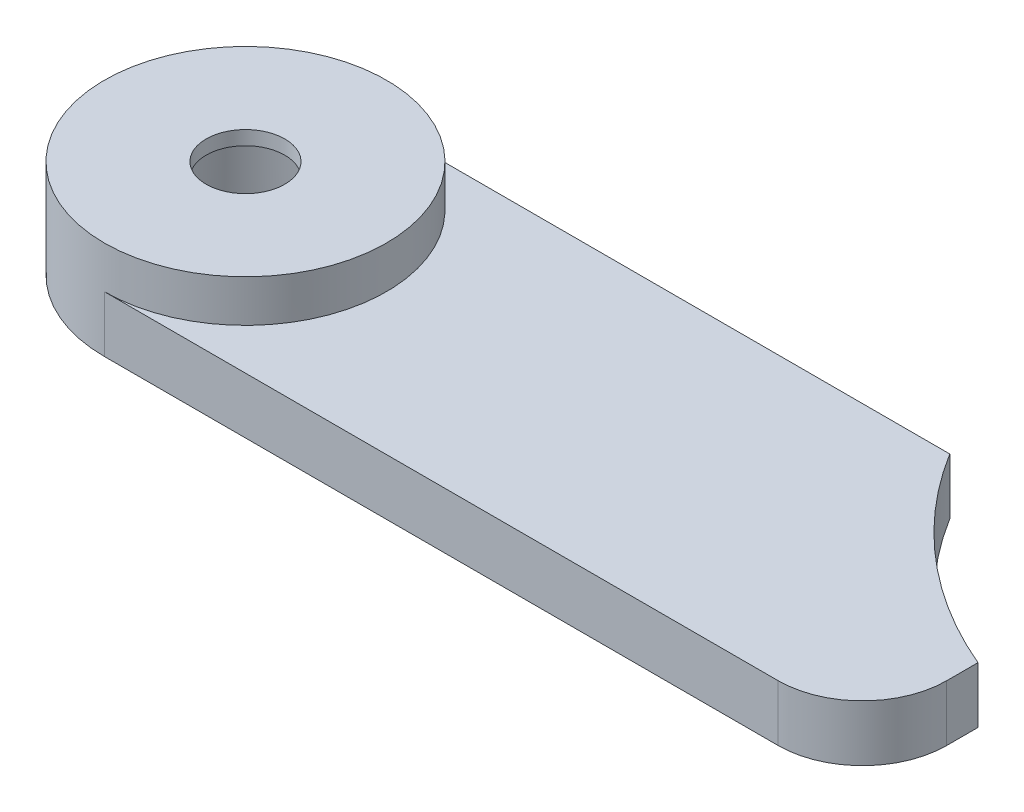
ISO-10303-21;
HEADER;
FILE_DESCRIPTION(('STEP AP214'),'2;1');
FILE_NAME('part.step','',(''),(''),'','','');
FILE_SCHEMA(('AUTOMOTIVE_DESIGN { 1 0 10303 214 1 1 1 1 }'));
ENDSEC;
DATA;
#1=APPLICATION_CONTEXT('core data for automotive mechanical design processes');
#2=APPLICATION_PROTOCOL_DEFINITION('international standard','automotive_design',2000,#1);
#3=PRODUCT_CONTEXT('',#1,'mechanical');
#4=PRODUCT('Part','Part','',(#3));
#5=PRODUCT_RELATED_PRODUCT_CATEGORY('part','',(#4));
#6=PRODUCT_DEFINITION_FORMATION('','',#4);
#7=PRODUCT_DEFINITION_CONTEXT('part definition',#1,'design');
#8=PRODUCT_DEFINITION('design','',#6,#7);
#9=PRODUCT_DEFINITION_SHAPE('','',#8);
#10=(LENGTH_UNIT() NAMED_UNIT(*) SI_UNIT(.MILLI.,.METRE.));
#11=(NAMED_UNIT(*) PLANE_ANGLE_UNIT() SI_UNIT($,.RADIAN.));
#12=(NAMED_UNIT(*) SI_UNIT($,.STERADIAN.) SOLID_ANGLE_UNIT());
#13=UNCERTAINTY_MEASURE_WITH_UNIT(LENGTH_MEASURE(1.E-05),#10,'distance_accuracy_value','');
#14=(GEOMETRIC_REPRESENTATION_CONTEXT(3) GLOBAL_UNCERTAINTY_ASSIGNED_CONTEXT((#13)) GLOBAL_UNIT_ASSIGNED_CONTEXT((#10,
#11,#12)) REPRESENTATION_CONTEXT('',''));
#15=CARTESIAN_POINT('',(0.,0.,0.));
#16=DIRECTION('',(0.,0.,1.));
#17=DIRECTION('',(1.,0.,0.));
#18=AXIS2_PLACEMENT_3D('',#15,#16,#17);
#19=CARTESIAN_POINT('',(0.,3.,0.));
#20=DIRECTION('',(0.,-1.,0.));
#21=DIRECTION('',(0.,0.,-1.));
#22=AXIS2_PLACEMENT_3D('',#19,#20,#21);
#23=CYLINDRICAL_SURFACE('',#22,5.025);
#24=DIRECTION('',(0.,-1.,0.));
#25=VECTOR('',#24,1.);
#26=CARTESIAN_POINT('',(0.,2.,5.025));
#27=LINE('',#26,#25);
#28=CARTESIAN_POINT('',(0.,2.,5.025));
#29=VERTEX_POINT('',#28);
#30=CARTESIAN_POINT('',(0.,0.,5.025));
#31=VERTEX_POINT('',#30);
#32=EDGE_CURVE('E118',#29,#31,#27,.T.);
#33=ORIENTED_EDGE('',*,*,#32,.F.);
#34=CARTESIAN_POINT('',(0.,2.,0.));
#35=DIRECTION('',(0.,-1.,0.));
#36=DIRECTION('',(0.,0.,-1.));
#37=AXIS2_PLACEMENT_3D('',#34,#35,#36);
#38=CIRCLE('',#37,5.025);
#39=CARTESIAN_POINT('',(0.,2.,-5.025));
#40=VERTEX_POINT('',#39);
#41=EDGE_CURVE('E121',#40,#29,#38,.T.);
#42=ORIENTED_EDGE('',*,*,#41,.F.);
#43=DIRECTION('',(0.,-1.,0.));
#44=VECTOR('',#43,1.);
#45=CARTESIAN_POINT('',(0.,2.,-5.025));
#46=LINE('',#45,#44);
#47=CARTESIAN_POINT('',(0.,0.,-5.025));
#48=VERTEX_POINT('',#47);
#49=EDGE_CURVE('E122',#40,#48,#46,.T.);
#50=ORIENTED_EDGE('',*,*,#49,.T.);
#51=CARTESIAN_POINT('',(0.,0.,0.));
#52=DIRECTION('',(0.,1.,0.));
#53=DIRECTION('',(0.,0.,1.));
#54=AXIS2_PLACEMENT_3D('',#51,#52,#53);
#55=CIRCLE('',#54,5.025);
#56=EDGE_CURVE('E106',#48,#31,#55,.T.);
#57=ORIENTED_EDGE('',*,*,#56,.T.);
#58=EDGE_LOOP('',(#33,#42,#50,#57));
#59=FACE_BOUND('',#58,.T.);
#60=CARTESIAN_POINT('',(0.,3.5,0.));
#61=DIRECTION('',(0.,1.,0.));
#62=DIRECTION('',(0.,0.,1.));
#63=AXIS2_PLACEMENT_3D('',#60,#61,#62);
#64=CIRCLE('',#63,5.025);
#65=CARTESIAN_POINT('',(0.,3.5,5.025));
#66=VERTEX_POINT('',#65);
#67=EDGE_CURVE('E148',#66,#66,#64,.T.);
#68=ORIENTED_EDGE('',*,*,#67,.F.);
#69=EDGE_LOOP('',(#68));
#70=FACE_BOUND('',#69,.T.);
#71=ADVANCED_FACE('F33',(#59,#70),#23,.T.);
#72=CARTESIAN_POINT('',(0.,0.,0.));
#73=DIRECTION('',(0.,1.,0.));
#74=DIRECTION('',(0.,0.,1.));
#75=AXIS2_PLACEMENT_3D('',#72,#73,#74);
#76=PLANE('',#75);
#77=CARTESIAN_POINT('',(0.,0.,0.));
#78=DIRECTION('',(0.,1.,0.));
#79=DIRECTION('',(0.,0.,1.));
#80=AXIS2_PLACEMENT_3D('',#77,#78,#79);
#81=CIRCLE('',#80,2.76246599057777);
#82=CARTESIAN_POINT('',(0.,0.,2.76246599057777));
#83=VERTEX_POINT('',#82);
#84=EDGE_CURVE('E37',#83,#83,#81,.T.);
#85=ORIENTED_EDGE('',*,*,#84,.T.);
#86=EDGE_LOOP('',(#85));
#87=FACE_BOUND('',#86,.T.);
#88=DIRECTION('',(0.,0.,1.));
#89=VECTOR('',#88,1.);
#90=CARTESIAN_POINT('',(27.,0.,5.025));
#91=LINE('',#90,#89);
#92=CARTESIAN_POINT('',(27.,0.,0.909059829990639));
#93=VERTEX_POINT('',#92);
#94=CARTESIAN_POINT('',(27.,0.,2.025));
#95=VERTEX_POINT('',#94);
#96=EDGE_CURVE('E108',#93,#95,#91,.T.);
#97=ORIENTED_EDGE('',*,*,#96,.T.);
#98=CARTESIAN_POINT('',(24.,0.,2.025));
#99=DIRECTION('',(0.,1.,0.));
#100=DIRECTION('',(0.,0.,1.));
#101=AXIS2_PLACEMENT_3D('',#98,#99,#100);
#102=CIRCLE('',#101,3.);
#103=CARTESIAN_POINT('',(24.,0.,5.025));
#104=VERTEX_POINT('',#103);
#105=EDGE_CURVE('E56',#95,#104,#102,.F.);
#106=ORIENTED_EDGE('',*,*,#105,.T.);
#107=DIRECTION('',(-1.,0.,0.));
#108=VECTOR('',#107,1.);
#109=CARTESIAN_POINT('',(0.,0.,5.025));
#110=LINE('',#109,#108);
#111=EDGE_CURVE('E110',#104,#31,#110,.T.);
#112=ORIENTED_EDGE('',*,*,#111,.T.);
#113=ORIENTED_EDGE('',*,*,#56,.F.);
#114=DIRECTION('',(1.,0.,0.));
#115=VECTOR('',#114,1.);
#116=CARTESIAN_POINT('',(0.,0.,-5.025));
#117=LINE('',#116,#115);
#118=CARTESIAN_POINT('',(20.0604553446339,0.,-5.025));
#119=VERTEX_POINT('',#118);
#120=EDGE_CURVE('E100',#48,#119,#117,.T.);
#121=ORIENTED_EDGE('',*,*,#120,.T.);
#122=CARTESIAN_POINT('',(32.8162280293824,0.,-12.9174180841503));
#123=DIRECTION('',(0.,1.,0.));
#124=DIRECTION('',(0.,0.,1.));
#125=AXIS2_PLACEMENT_3D('',#122,#123,#124);
#126=CIRCLE('',#125,15.);
#127=EDGE_CURVE('E84',#119,#93,#126,.T.);
#128=ORIENTED_EDGE('',*,*,#127,.T.);
#129=EDGE_LOOP('',(#97,#106,#112,#113,#121,#128));
#130=FACE_BOUND('',#129,.T.);
#131=ADVANCED_FACE('F104',(#87,#130),#76,.F.);
#132=CARTESIAN_POINT('',(0.,2.,5.025));
#133=DIRECTION('',(0.,0.,1.));
#134=DIRECTION('',(1.,0.,0.));
#135=AXIS2_PLACEMENT_3D('',#132,#133,#134);
#136=PLANE('',#135);
#137=ORIENTED_EDGE('',*,*,#111,.F.);
#138=DIRECTION('',(0.,-1.,0.));
#139=VECTOR('',#138,1.);
#140=CARTESIAN_POINT('',(24.,2.,5.025));
#141=LINE('',#140,#139);
#142=CARTESIAN_POINT('',(24.,2.,5.025));
#143=VERTEX_POINT('',#142);
#144=EDGE_CURVE('E42',#104,#143,#141,.F.);
#145=ORIENTED_EDGE('',*,*,#144,.T.);
#146=DIRECTION('',(-1.,0.,0.));
#147=VECTOR('',#146,1.);
#148=CARTESIAN_POINT('',(0.,2.,5.025));
#149=LINE('',#148,#147);
#150=EDGE_CURVE('E114',#143,#29,#149,.T.);
#151=ORIENTED_EDGE('',*,*,#150,.T.);
#152=ORIENTED_EDGE('',*,*,#32,.T.);
#153=EDGE_LOOP('',(#137,#145,#151,#152));
#154=FACE_BOUND('',#153,.T.);
#155=ADVANCED_FACE('F181',(#154),#136,.T.);
#156=CARTESIAN_POINT('',(27.,2.,5.025));
#157=DIRECTION('',(1.,0.,0.));
#158=DIRECTION('',(0.,0.,-1.));
#159=AXIS2_PLACEMENT_3D('',#156,#157,#158);
#160=PLANE('',#159);
#161=DIRECTION('',(0.,0.,1.));
#162=VECTOR('',#161,1.);
#163=CARTESIAN_POINT('',(27.,2.,5.025));
#164=LINE('',#163,#162);
#165=CARTESIAN_POINT('',(27.,2.,0.909059829990639));
#166=VERTEX_POINT('',#165);
#167=CARTESIAN_POINT('',(27.,2.,2.025));
#168=VERTEX_POINT('',#167);
#169=EDGE_CURVE('E136',#166,#168,#164,.T.);
#170=ORIENTED_EDGE('',*,*,#169,.T.);
#171=DIRECTION('',(0.,-1.,0.));
#172=VECTOR('',#171,1.);
#173=CARTESIAN_POINT('',(27.,2.,2.025));
#174=LINE('',#173,#172);
#175=EDGE_CURVE('E127',#168,#95,#174,.T.);
#176=ORIENTED_EDGE('',*,*,#175,.T.);
#177=ORIENTED_EDGE('',*,*,#96,.F.);
#178=DIRECTION('',(0.,1.,0.));
#179=VECTOR('',#178,1.);
#180=CARTESIAN_POINT('',(27.,0.,0.909059829990639));
#181=LINE('',#180,#179);
#182=EDGE_CURVE('E90',#166,#93,#181,.F.);
#183=ORIENTED_EDGE('',*,*,#182,.F.);
#184=EDGE_LOOP('',(#170,#176,#177,#183));
#185=FACE_BOUND('',#184,.T.);
#186=ADVANCED_FACE('F134',(#185),#160,.T.);
#187=CARTESIAN_POINT('',(0.,2.,-5.025));
#188=DIRECTION('',(0.,0.,-1.));
#189=DIRECTION('',(-1.,0.,0.));
#190=AXIS2_PLACEMENT_3D('',#187,#188,#189);
#191=PLANE('',#190);
#192=DIRECTION('',(0.,1.,0.));
#193=VECTOR('',#192,1.);
#194=CARTESIAN_POINT('',(20.0604553446339,0.,-5.025));
#195=LINE('',#194,#193);
#196=CARTESIAN_POINT('',(20.0604553446339,2.,-5.025));
#197=VERTEX_POINT('',#196);
#198=EDGE_CURVE('E87',#119,#197,#195,.T.);
#199=ORIENTED_EDGE('',*,*,#198,.F.);
#200=ORIENTED_EDGE('',*,*,#120,.F.);
#201=ORIENTED_EDGE('',*,*,#49,.F.);
#202=DIRECTION('',(1.,0.,0.));
#203=VECTOR('',#202,1.);
#204=CARTESIAN_POINT('',(0.,2.,-5.025));
#205=LINE('',#204,#203);
#206=EDGE_CURVE('E102',#40,#197,#205,.T.);
#207=ORIENTED_EDGE('',*,*,#206,.T.);
#208=EDGE_LOOP('',(#199,#200,#201,#207));
#209=FACE_BOUND('',#208,.T.);
#210=ADVANCED_FACE('F98',(#209),#191,.T.);
#211=CARTESIAN_POINT('',(0.,2.,0.));
#212=DIRECTION('',(0.,-1.,0.));
#213=DIRECTION('',(0.,0.,-1.));
#214=AXIS2_PLACEMENT_3D('',#211,#212,#213);
#215=PLANE('',#214);
#216=ORIENTED_EDGE('',*,*,#150,.F.);
#217=CARTESIAN_POINT('',(24.,2.,2.025));
#218=DIRECTION('',(0.,-1.,0.));
#219=DIRECTION('',(0.,0.,-1.));
#220=AXIS2_PLACEMENT_3D('',#217,#218,#219);
#221=CIRCLE('',#220,3.);
#222=EDGE_CURVE('E11',#143,#168,#221,.F.);
#223=ORIENTED_EDGE('',*,*,#222,.T.);
#224=ORIENTED_EDGE('',*,*,#169,.F.);
#225=CARTESIAN_POINT('',(32.8162280293824,2.,-12.9174180841503));
#226=DIRECTION('',(0.,1.,0.));
#227=DIRECTION('',(0.,0.,1.));
#228=AXIS2_PLACEMENT_3D('',#225,#226,#227);
#229=CIRCLE('',#228,15.);
#230=EDGE_CURVE('E93',#197,#166,#229,.T.);
#231=ORIENTED_EDGE('',*,*,#230,.F.);
#232=ORIENTED_EDGE('',*,*,#206,.F.);
#233=ORIENTED_EDGE('',*,*,#41,.T.);
#234=EDGE_LOOP('',(#216,#223,#224,#231,#232,#233));
#235=FACE_BOUND('',#234,.T.);
#236=ADVANCED_FACE('F140',(#235),#215,.F.);
#237=CARTESIAN_POINT('',(32.8162280293824,0.,-12.9174180841503));
#238=DIRECTION('',(0.,1.,0.));
#239=DIRECTION('',(0.,0.,1.));
#240=AXIS2_PLACEMENT_3D('',#237,#238,#239);
#241=CYLINDRICAL_SURFACE('',#240,15.);
#242=ORIENTED_EDGE('',*,*,#182,.T.);
#243=ORIENTED_EDGE('',*,*,#127,.F.);
#244=ORIENTED_EDGE('',*,*,#198,.T.);
#245=ORIENTED_EDGE('',*,*,#230,.T.);
#246=EDGE_LOOP('',(#242,#243,#244,#245));
#247=FACE_BOUND('',#246,.T.);
#248=ADVANCED_FACE('F86',(#247),#241,.F.);
#249=CARTESIAN_POINT('',(24.,2.,2.025));
#250=DIRECTION('',(0.,-1.,0.));
#251=DIRECTION('',(0.,0.,-1.));
#252=AXIS2_PLACEMENT_3D('',#249,#250,#251);
#253=CYLINDRICAL_SURFACE('',#252,3.);
#254=ORIENTED_EDGE('',*,*,#222,.F.);
#255=ORIENTED_EDGE('',*,*,#144,.F.);
#256=ORIENTED_EDGE('',*,*,#105,.F.);
#257=ORIENTED_EDGE('',*,*,#175,.F.);
#258=EDGE_LOOP('',(#254,#255,#256,#257));
#259=FACE_BOUND('',#258,.T.);
#260=ADVANCED_FACE('F35',(#259),#253,.T.);
#261=CARTESIAN_POINT('',(0.,3.,0.));
#262=DIRECTION('',(0.,-1.,0.));
#263=DIRECTION('',(0.,0.,1.));
#264=AXIS2_PLACEMENT_3D('',#261,#262,#263);
#265=CONICAL_SURFACE('',#264,2.5,0.0872664625997165);
#266=CARTESIAN_POINT('',(0.,3.,0.));
#267=DIRECTION('',(0.,1.,0.));
#268=DIRECTION('',(0.,0.,1.));
#269=AXIS2_PLACEMENT_3D('',#266,#267,#268);
#270=CIRCLE('',#269,2.5);
#271=CARTESIAN_POINT('',(0.,3.,2.5));
#272=VERTEX_POINT('',#271);
#273=EDGE_CURVE('E145',#272,#272,#270,.F.);
#274=ORIENTED_EDGE('',*,*,#273,.F.);
#275=EDGE_LOOP('',(#274));
#276=FACE_BOUND('',#275,.T.);
#277=ORIENTED_EDGE('',*,*,#84,.F.);
#278=EDGE_LOOP('',(#277));
#279=FACE_BOUND('',#278,.T.);
#280=ADVANCED_FACE('F170',(#276,#279),#265,.F.);
#281=CARTESIAN_POINT('',(0.,3.,0.));
#282=DIRECTION('',(0.,1.,0.));
#283=DIRECTION('',(0.,0.,1.));
#284=AXIS2_PLACEMENT_3D('',#281,#282,#283);
#285=PLANE('',#284);
#286=CARTESIAN_POINT('',(0.,3.,0.));
#287=DIRECTION('',(0.,-1.,0.));
#288=DIRECTION('',(0.,0.,-1.));
#289=AXIS2_PLACEMENT_3D('',#286,#287,#288);
#290=CIRCLE('',#289,1.4);
#291=CARTESIAN_POINT('',(0.,3.,-1.4));
#292=VERTEX_POINT('',#291);
#293=EDGE_CURVE('E152',#292,#292,#290,.T.);
#294=ORIENTED_EDGE('',*,*,#293,.F.);
#295=EDGE_LOOP('',(#294));
#296=FACE_BOUND('',#295,.T.);
#297=ORIENTED_EDGE('',*,*,#273,.T.);
#298=EDGE_LOOP('',(#297));
#299=FACE_BOUND('',#298,.T.);
#300=ADVANCED_FACE('F167',(#296,#299),#285,.F.);
#301=CARTESIAN_POINT('',(0.,3.5,0.));
#302=DIRECTION('',(0.,1.,0.));
#303=DIRECTION('',(0.,0.,1.));
#304=AXIS2_PLACEMENT_3D('',#301,#302,#303);
#305=PLANE('',#304);
#306=CARTESIAN_POINT('',(0.,3.5,0.));
#307=DIRECTION('',(0.,-1.,0.));
#308=DIRECTION('',(0.,0.,-1.));
#309=AXIS2_PLACEMENT_3D('',#306,#307,#308);
#310=CIRCLE('',#309,1.4);
#311=CARTESIAN_POINT('',(0.,3.5,-1.4));
#312=VERTEX_POINT('',#311);
#313=EDGE_CURVE('E151',#312,#312,#310,.T.);
#314=ORIENTED_EDGE('',*,*,#313,.T.);
#315=EDGE_LOOP('',(#314));
#316=FACE_BOUND('',#315,.T.);
#317=ORIENTED_EDGE('',*,*,#67,.T.);
#318=EDGE_LOOP('',(#317));
#319=FACE_BOUND('',#318,.T.);
#320=ADVANCED_FACE('F158',(#316,#319),#305,.T.);
#321=CARTESIAN_POINT('',(0.,3.5,0.));
#322=DIRECTION('',(0.,-1.,0.));
#323=DIRECTION('',(0.,0.,-1.));
#324=AXIS2_PLACEMENT_3D('',#321,#322,#323);
#325=CYLINDRICAL_SURFACE('',#324,1.4);
#326=ORIENTED_EDGE('',*,*,#313,.F.);
#327=EDGE_LOOP('',(#326));
#328=FACE_BOUND('',#327,.T.);
#329=ORIENTED_EDGE('',*,*,#293,.T.);
#330=EDGE_LOOP('',(#329));
#331=FACE_BOUND('',#330,.T.);
#332=ADVANCED_FACE('F161',(#328,#331),#325,.F.);
#333=CLOSED_SHELL('',(#71,#131,#155,#186,#210,#236,#248,#260,#280,#300,#320,#332));
#334=MANIFOLD_SOLID_BREP('B2',#333);
#335=ADVANCED_BREP_SHAPE_REPRESENTATION('',(#18,#334),#14);
#336=SHAPE_DEFINITION_REPRESENTATION(#9,#335);
ENDSEC;
END-ISO-10303-21;
